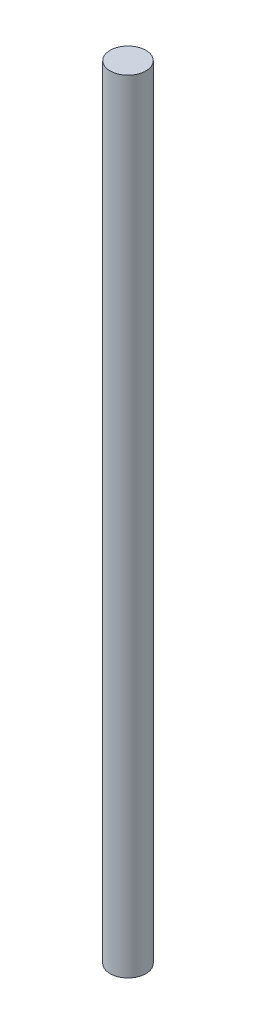
ISO-10303-21;
HEADER;
FILE_DESCRIPTION(('STEP AP214'),'2;1');
FILE_NAME('part.step','',(''),(''),'','','');
FILE_SCHEMA(('AUTOMOTIVE_DESIGN { 1 0 10303 214 1 1 1 1 }'));
ENDSEC;
DATA;
#1=APPLICATION_CONTEXT('core data for automotive mechanical design processes');
#2=APPLICATION_PROTOCOL_DEFINITION('international standard','automotive_design',2000,#1);
#3=PRODUCT_CONTEXT('',#1,'mechanical');
#4=PRODUCT('Part','Part','',(#3));
#5=PRODUCT_RELATED_PRODUCT_CATEGORY('part','',(#4));
#6=PRODUCT_DEFINITION_FORMATION('','',#4);
#7=PRODUCT_DEFINITION_CONTEXT('part definition',#1,'design');
#8=PRODUCT_DEFINITION('design','',#6,#7);
#9=PRODUCT_DEFINITION_SHAPE('','',#8);
#10=(LENGTH_UNIT() NAMED_UNIT(*) SI_UNIT(.MILLI.,.METRE.));
#11=(NAMED_UNIT(*) PLANE_ANGLE_UNIT() SI_UNIT($,.RADIAN.));
#12=(NAMED_UNIT(*) SI_UNIT($,.STERADIAN.) SOLID_ANGLE_UNIT());
#13=UNCERTAINTY_MEASURE_WITH_UNIT(LENGTH_MEASURE(1.E-05),#10,'distance_accuracy_value','');
#14=(GEOMETRIC_REPRESENTATION_CONTEXT(3) GLOBAL_UNCERTAINTY_ASSIGNED_CONTEXT((#13)) GLOBAL_UNIT_ASSIGNED_CONTEXT((#10,
#11,#12)) REPRESENTATION_CONTEXT('',''));
#15=CARTESIAN_POINT('',(0.,0.,0.));
#16=DIRECTION('',(0.,0.,1.));
#17=DIRECTION('',(1.,0.,0.));
#18=AXIS2_PLACEMENT_3D('',#15,#16,#17);
#19=CARTESIAN_POINT('',(0.,175.,0.));
#20=DIRECTION('',(0.,-1.,0.));
#21=DIRECTION('',(0.,0.,-1.));
#22=AXIS2_PLACEMENT_3D('',#19,#20,#21);
#23=CYLINDRICAL_SURFACE('',#22,4.);
#24=CARTESIAN_POINT('',(0.,175.,0.));
#25=DIRECTION('',(0.,1.,0.));
#26=DIRECTION('',(0.,0.,1.));
#27=AXIS2_PLACEMENT_3D('',#24,#25,#26);
#28=CIRCLE('',#27,4.);
#29=CARTESIAN_POINT('',(0.,175.,4.));
#30=VERTEX_POINT('',#29);
#31=EDGE_CURVE('E10',#30,#30,#28,.T.);
#32=ORIENTED_EDGE('',*,*,#31,.F.);
#33=EDGE_LOOP('',(#32));
#34=FACE_BOUND('',#33,.T.);
#35=CARTESIAN_POINT('',(0.,0.,0.));
#36=DIRECTION('',(0.,1.,0.));
#37=DIRECTION('',(0.,0.,1.));
#38=AXIS2_PLACEMENT_3D('',#35,#36,#37);
#39=CIRCLE('',#38,4.);
#40=CARTESIAN_POINT('',(0.,0.,4.));
#41=VERTEX_POINT('',#40);
#42=EDGE_CURVE('E46',#41,#41,#39,.T.);
#43=ORIENTED_EDGE('',*,*,#42,.T.);
#44=EDGE_LOOP('',(#43));
#45=FACE_BOUND('',#44,.T.);
#46=ADVANCED_FACE('F43',(#34,#45),#23,.T.);
#47=CARTESIAN_POINT('',(0.,175.,0.));
#48=DIRECTION('',(0.,1.,0.));
#49=DIRECTION('',(0.,0.,1.));
#50=AXIS2_PLACEMENT_3D('',#47,#48,#49);
#51=PLANE('',#50);
#52=ORIENTED_EDGE('',*,*,#31,.T.);
#53=EDGE_LOOP('',(#52));
#54=FACE_BOUND('',#53,.T.);
#55=ADVANCED_FACE('F59',(#54),#51,.T.);
#56=CARTESIAN_POINT('',(0.,0.,0.));
#57=DIRECTION('',(0.,1.,0.));
#58=DIRECTION('',(0.,0.,1.));
#59=AXIS2_PLACEMENT_3D('',#56,#57,#58);
#60=PLANE('',#59);
#61=ORIENTED_EDGE('',*,*,#42,.F.);
#62=EDGE_LOOP('',(#61));
#63=FACE_BOUND('',#62,.T.);
#64=ADVANCED_FACE('F57',(#63),#60,.F.);
#65=CLOSED_SHELL('',(#46,#55,#64));
#66=MANIFOLD_SOLID_BREP('B2',#65);
#67=ADVANCED_BREP_SHAPE_REPRESENTATION('',(#18,#66),#14);
#68=SHAPE_DEFINITION_REPRESENTATION(#9,#67);
ENDSEC;
END-ISO-10303-21;
